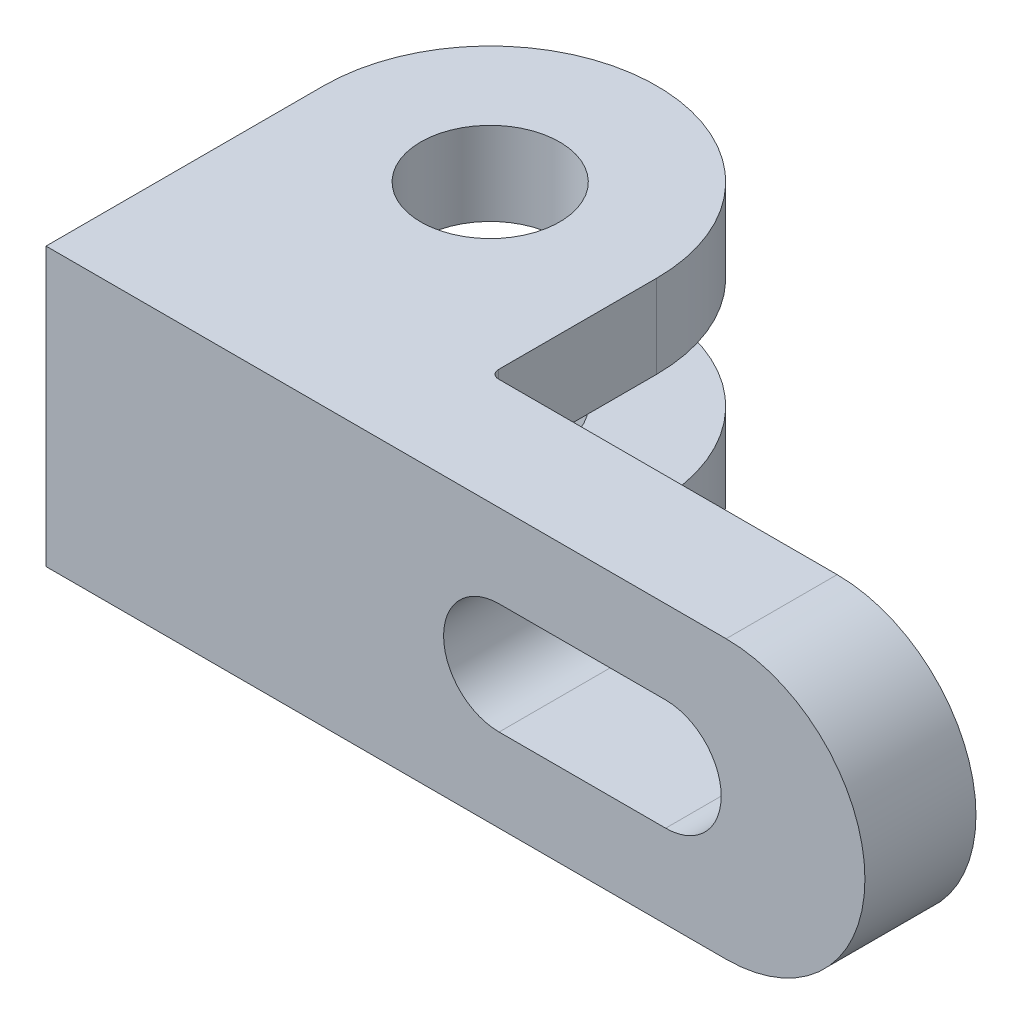
ISO-10303-21;
HEADER;
FILE_DESCRIPTION(('STEP AP214'),'2;1');
FILE_NAME('part.step','',(''),(''),'','','');
FILE_SCHEMA(('AUTOMOTIVE_DESIGN { 1 0 10303 214 1 1 1 1 }'));
ENDSEC;
DATA;
#1=APPLICATION_CONTEXT('core data for automotive mechanical design processes');
#2=APPLICATION_PROTOCOL_DEFINITION('international standard','automotive_design',2000,#1);
#3=PRODUCT_CONTEXT('',#1,'mechanical');
#4=PRODUCT('Part','Part','',(#3));
#5=PRODUCT_RELATED_PRODUCT_CATEGORY('part','',(#4));
#6=PRODUCT_DEFINITION_FORMATION('','',#4);
#7=PRODUCT_DEFINITION_CONTEXT('part definition',#1,'design');
#8=PRODUCT_DEFINITION('design','',#6,#7);
#9=PRODUCT_DEFINITION_SHAPE('','',#8);
#10=(LENGTH_UNIT() NAMED_UNIT(*) SI_UNIT(.MILLI.,.METRE.));
#11=(NAMED_UNIT(*) PLANE_ANGLE_UNIT() SI_UNIT($,.RADIAN.));
#12=(NAMED_UNIT(*) SI_UNIT($,.STERADIAN.) SOLID_ANGLE_UNIT());
#13=UNCERTAINTY_MEASURE_WITH_UNIT(LENGTH_MEASURE(1.E-05),#10,'distance_accuracy_value','');
#14=(GEOMETRIC_REPRESENTATION_CONTEXT(3) GLOBAL_UNCERTAINTY_ASSIGNED_CONTEXT((#13)) GLOBAL_UNIT_ASSIGNED_CONTEXT((#10,
#11,#12)) REPRESENTATION_CONTEXT('',''));
#15=CARTESIAN_POINT('',(0.,0.,0.));
#16=DIRECTION('',(0.,0.,1.));
#17=DIRECTION('',(1.,0.,0.));
#18=AXIS2_PLACEMENT_3D('',#15,#16,#17);
#19=CARTESIAN_POINT('',(0.,0.,-8.));
#20=DIRECTION('',(0.,0.,1.));
#21=DIRECTION('',(1.,0.,0.));
#22=AXIS2_PLACEMENT_3D('',#19,#20,#21);
#23=PLANE('',#22);
#24=DIRECTION('',(1.,0.,0.));
#25=VECTOR('',#24,1.);
#26=CARTESIAN_POINT('',(0.,8.,-8.));
#27=LINE('',#26,#25);
#28=CARTESIAN_POINT('',(6.28495317609002,8.,-8.));
#29=VERTEX_POINT('',#28);
#30=CARTESIAN_POINT('',(30.28495317609,8.,-8.));
#31=VERTEX_POINT('',#30);
#32=EDGE_CURVE('E241',#29,#31,#27,.T.);
#33=ORIENTED_EDGE('',*,*,#32,.F.);
#34=CARTESIAN_POINT('',(6.28495317609002,0.,-8.));
#35=DIRECTION('',(0.,0.,1.));
#36=DIRECTION('',(1.,0.,0.));
#37=AXIS2_PLACEMENT_3D('',#34,#35,#36);
#38=CIRCLE('',#37,8.);
#39=CARTESIAN_POINT('',(6.28495317609002,-8.,-8.));
#40=VERTEX_POINT('',#39);
#41=EDGE_CURVE('E228',#29,#40,#38,.T.);
#42=ORIENTED_EDGE('',*,*,#41,.T.);
#43=DIRECTION('',(1.,0.,0.));
#44=VECTOR('',#43,1.);
#45=CARTESIAN_POINT('',(0.,-8.,-8.));
#46=LINE('',#45,#44);
#47=CARTESIAN_POINT('',(30.28495317609,-8.,-8.));
#48=VERTEX_POINT('',#47);
#49=EDGE_CURVE('E232',#40,#48,#46,.T.);
#50=ORIENTED_EDGE('',*,*,#49,.T.);
#51=CARTESIAN_POINT('',(30.28495317609,0.,-8.));
#52=DIRECTION('',(0.,0.,1.));
#53=DIRECTION('',(1.,0.,0.));
#54=AXIS2_PLACEMENT_3D('',#51,#52,#53);
#55=CIRCLE('',#54,8.);
#56=EDGE_CURVE('E237',#48,#31,#55,.T.);
#57=ORIENTED_EDGE('',*,*,#56,.T.);
#58=EDGE_LOOP('',(#33,#42,#50,#57));
#59=FACE_BOUND('',#58,.T.);
#60=DIRECTION('',(1.,0.,0.));
#61=VECTOR('',#60,1.);
#62=CARTESIAN_POINT('',(0.,-20.,-8.));
#63=LINE('',#62,#61);
#64=CARTESIAN_POINT('',(-9.80000000000006,-20.,-8.));
#65=VERTEX_POINT('',#64);
#66=CARTESIAN_POINT('',(38.9999999999999,-20.,-8.));
#67=VERTEX_POINT('',#66);
#68=EDGE_CURVE('E261',#65,#67,#63,.T.);
#69=ORIENTED_EDGE('',*,*,#68,.F.);
#70=DIRECTION('',(0.,-1.,0.));
#71=VECTOR('',#70,1.);
#72=CARTESIAN_POINT('',(-9.80000000000006,-8.00000000000001,-8.));
#73=LINE('',#72,#71);
#74=CARTESIAN_POINT('',(-9.80000000000006,-8.00000000000001,-8.));
#75=VERTEX_POINT('',#74);
#76=EDGE_CURVE('E335',#65,#75,#73,.F.);
#77=ORIENTED_EDGE('',*,*,#76,.T.);
#78=DIRECTION('',(-1.,0.,0.));
#79=VECTOR('',#78,1.);
#80=CARTESIAN_POINT('',(0.,-8.00000000000001,-8.));
#81=LINE('',#80,#79);
#82=CARTESIAN_POINT('',(-59.0000000000001,-8.00000000000001,-8.));
#83=VERTEX_POINT('',#82);
#84=EDGE_CURVE('E56',#75,#83,#81,.T.);
#85=ORIENTED_EDGE('',*,*,#84,.T.);
#86=DIRECTION('',(0.,-1.,0.));
#87=VECTOR('',#86,1.);
#88=CARTESIAN_POINT('',(-59.0000000000001,0.,-8.));
#89=LINE('',#88,#87);
#90=CARTESIAN_POINT('',(-59.0000000000001,8.00000000000001,-8.));
#91=VERTEX_POINT('',#90);
#92=EDGE_CURVE('E276',#91,#83,#89,.T.);
#93=ORIENTED_EDGE('',*,*,#92,.F.);
#94=DIRECTION('',(-1.,0.,0.));
#95=VECTOR('',#94,1.);
#96=CARTESIAN_POINT('',(0.,8.00000000000001,-8.));
#97=LINE('',#96,#95);
#98=CARTESIAN_POINT('',(-9.80000000000006,8.00000000000001,-8.));
#99=VERTEX_POINT('',#98);
#100=EDGE_CURVE('E207',#99,#91,#97,.T.);
#101=ORIENTED_EDGE('',*,*,#100,.F.);
#102=DIRECTION('',(0.,1.,0.));
#103=VECTOR('',#102,1.);
#104=CARTESIAN_POINT('',(-9.80000000000006,0.,-8.));
#105=LINE('',#104,#103);
#106=CARTESIAN_POINT('',(-9.80000000000006,20.,-8.));
#107=VERTEX_POINT('',#106);
#108=EDGE_CURVE('E312',#99,#107,#105,.T.);
#109=ORIENTED_EDGE('',*,*,#108,.T.);
#110=DIRECTION('',(1.,0.,0.));
#111=VECTOR('',#110,1.);
#112=CARTESIAN_POINT('',(0.,20.,-8.));
#113=LINE('',#112,#111);
#114=CARTESIAN_POINT('',(38.9999999999999,20.,-8.));
#115=VERTEX_POINT('',#114);
#116=EDGE_CURVE('E293',#107,#115,#113,.T.);
#117=ORIENTED_EDGE('',*,*,#116,.T.);
#118=CARTESIAN_POINT('',(38.9999999999999,0.,-8.));
#119=DIRECTION('',(0.,0.,1.));
#120=DIRECTION('',(1.,0.,0.));
#121=AXIS2_PLACEMENT_3D('',#118,#119,#120);
#122=CIRCLE('',#121,20.);
#123=EDGE_CURVE('E289',#67,#115,#122,.T.);
#124=ORIENTED_EDGE('',*,*,#123,.F.);
#125=EDGE_LOOP('',(#69,#77,#85,#93,#101,#109,#117,#124));
#126=FACE_BOUND('',#125,.T.);
#127=ADVANCED_FACE('F41',(#59,#126),#23,.F.);
#128=CARTESIAN_POINT('',(0.,-20.,8.));
#129=DIRECTION('',(0.,1.,0.));
#130=DIRECTION('',(0.,0.,1.));
#131=AXIS2_PLACEMENT_3D('',#128,#129,#130);
#132=PLANE('',#131);
#133=CARTESIAN_POINT('',(-35.0000000000001,-20.,-32.));
#134=DIRECTION('',(0.,1.,0.));
#135=DIRECTION('',(-1.,0.,0.));
#136=AXIS2_PLACEMENT_3D('',#133,#134,#135);
#137=CIRCLE('',#136,10.);
#138=CARTESIAN_POINT('',(-45.0000000000001,-20.,-32.));
#139=VERTEX_POINT('',#138);
#140=EDGE_CURVE('E183',#139,#139,#137,.T.);
#141=ORIENTED_EDGE('',*,*,#140,.T.);
#142=EDGE_LOOP('',(#141));
#143=FACE_BOUND('',#142,.T.);
#144=DIRECTION('',(0.,0.,-1.));
#145=VECTOR('',#144,1.);
#146=CARTESIAN_POINT('',(-59.0000000000001,-20.,8.));
#147=LINE('',#146,#145);
#148=CARTESIAN_POINT('',(-59.0000000000001,-20.,8.));
#149=VERTEX_POINT('',#148);
#150=CARTESIAN_POINT('',(-59.0000000000001,-20.,-32.));
#151=VERTEX_POINT('',#150);
#152=EDGE_CURVE('E286',#149,#151,#147,.T.);
#153=ORIENTED_EDGE('',*,*,#152,.T.);
#154=CARTESIAN_POINT('',(-35.0000000000001,-20.,-32.));
#155=DIRECTION('',(0.,1.,0.));
#156=DIRECTION('',(-1.,0.,0.));
#157=AXIS2_PLACEMENT_3D('',#154,#155,#156);
#158=CIRCLE('',#157,24.);
#159=CARTESIAN_POINT('',(-11.0000000000001,-20.,-32.));
#160=VERTEX_POINT('',#159);
#161=EDGE_CURVE('E180',#160,#151,#158,.T.);
#162=ORIENTED_EDGE('',*,*,#161,.F.);
#163=DIRECTION('',(0.,0.,-1.));
#164=VECTOR('',#163,1.);
#165=CARTESIAN_POINT('',(-11.0000000000001,-20.,0.));
#166=LINE('',#165,#164);
#167=CARTESIAN_POINT('',(-11.0000000000001,-20.,-9.2));
#168=VERTEX_POINT('',#167);
#169=EDGE_CURVE('E166',#168,#160,#166,.T.);
#170=ORIENTED_EDGE('',*,*,#169,.F.);
#171=CARTESIAN_POINT('',(-9.80000000000006,-20.,-9.2));
#172=DIRECTION('',(0.,1.,0.));
#173=DIRECTION('',(0.,0.,1.));
#174=AXIS2_PLACEMENT_3D('',#171,#172,#173);
#175=CIRCLE('',#174,1.2);
#176=EDGE_CURVE('E50',#168,#65,#175,.T.);
#177=ORIENTED_EDGE('',*,*,#176,.T.);
#178=ORIENTED_EDGE('',*,*,#68,.T.);
#179=DIRECTION('',(0.,0.,-1.));
#180=VECTOR('',#179,1.);
#181=CARTESIAN_POINT('',(38.9999999999999,-20.,8.));
#182=LINE('',#181,#180);
#183=CARTESIAN_POINT('',(38.9999999999999,-20.,8.));
#184=VERTEX_POINT('',#183);
#185=EDGE_CURVE('E308',#184,#67,#182,.T.);
#186=ORIENTED_EDGE('',*,*,#185,.F.);
#187=DIRECTION('',(1.,0.,0.));
#188=VECTOR('',#187,1.);
#189=CARTESIAN_POINT('',(0.,-20.,8.));
#190=LINE('',#189,#188);
#191=EDGE_CURVE('E271',#149,#184,#190,.T.);
#192=ORIENTED_EDGE('',*,*,#191,.F.);
#193=EDGE_LOOP('',(#153,#162,#170,#177,#178,#186,#192));
#194=FACE_BOUND('',#193,.T.);
#195=ADVANCED_FACE('F343',(#143,#194),#132,.F.);
#196=CARTESIAN_POINT('',(38.9999999999999,0.,8.));
#197=DIRECTION('',(0.,0.,-1.));
#198=DIRECTION('',(-1.,0.,0.));
#199=AXIS2_PLACEMENT_3D('',#196,#197,#198);
#200=CYLINDRICAL_SURFACE('',#199,20.);
#201=ORIENTED_EDGE('',*,*,#123,.T.);
#202=DIRECTION('',(0.,0.,-1.));
#203=VECTOR('',#202,1.);
#204=CARTESIAN_POINT('',(38.9999999999999,20.,8.));
#205=LINE('',#204,#203);
#206=CARTESIAN_POINT('',(38.9999999999999,20.,8.));
#207=VERTEX_POINT('',#206);
#208=EDGE_CURVE('E304',#207,#115,#205,.T.);
#209=ORIENTED_EDGE('',*,*,#208,.F.);
#210=CARTESIAN_POINT('',(38.9999999999999,0.,8.));
#211=DIRECTION('',(0.,0.,1.));
#212=DIRECTION('',(1.,0.,0.));
#213=AXIS2_PLACEMENT_3D('',#210,#211,#212);
#214=CIRCLE('',#213,20.);
#215=EDGE_CURVE('E275',#184,#207,#214,.T.);
#216=ORIENTED_EDGE('',*,*,#215,.F.);
#217=ORIENTED_EDGE('',*,*,#185,.T.);
#218=EDGE_LOOP('',(#201,#209,#216,#217));
#219=FACE_BOUND('',#218,.T.);
#220=ADVANCED_FACE('F376',(#219),#200,.T.);
#221=CARTESIAN_POINT('',(0.,20.,8.));
#222=DIRECTION('',(0.,1.,0.));
#223=DIRECTION('',(-1.,0.,0.));
#224=AXIS2_PLACEMENT_3D('',#221,#222,#223);
#225=PLANE('',#224);
#226=CARTESIAN_POINT('',(-35.0000000000001,20.,-32.));
#227=DIRECTION('',(0.,1.,0.));
#228=DIRECTION('',(-1.,0.,0.));
#229=AXIS2_PLACEMENT_3D('',#226,#227,#228);
#230=CIRCLE('',#229,10.);
#231=CARTESIAN_POINT('',(-45.0000000000001,20.,-32.));
#232=VERTEX_POINT('',#231);
#233=EDGE_CURVE('E193',#232,#232,#230,.T.);
#234=ORIENTED_EDGE('',*,*,#233,.F.);
#235=EDGE_LOOP('',(#234));
#236=FACE_BOUND('',#235,.T.);
#237=ORIENTED_EDGE('',*,*,#116,.F.);
#238=CARTESIAN_POINT('',(-9.80000000000006,20.,-9.2));
#239=DIRECTION('',(0.,1.,0.));
#240=DIRECTION('',(-1.,0.,0.));
#241=AXIS2_PLACEMENT_3D('',#238,#239,#240);
#242=CIRCLE('',#241,1.2);
#243=CARTESIAN_POINT('',(-11.0000000000001,20.,-9.2));
#244=VERTEX_POINT('',#243);
#245=EDGE_CURVE('E325',#107,#244,#242,.F.);
#246=ORIENTED_EDGE('',*,*,#245,.T.);
#247=DIRECTION('',(0.,0.,-1.));
#248=VECTOR('',#247,1.);
#249=CARTESIAN_POINT('',(-11.0000000000001,20.,0.));
#250=LINE('',#249,#248);
#251=CARTESIAN_POINT('',(-11.0000000000001,20.,-32.));
#252=VERTEX_POINT('',#251);
#253=EDGE_CURVE('E204',#244,#252,#250,.T.);
#254=ORIENTED_EDGE('',*,*,#253,.T.);
#255=CARTESIAN_POINT('',(-35.0000000000001,20.,-32.));
#256=DIRECTION('',(0.,1.,0.));
#257=DIRECTION('',(-1.,0.,0.));
#258=AXIS2_PLACEMENT_3D('',#255,#256,#257);
#259=CIRCLE('',#258,24.);
#260=CARTESIAN_POINT('',(-59.0000000000001,20.,-32.));
#261=VERTEX_POINT('',#260);
#262=EDGE_CURVE('E214',#252,#261,#259,.T.);
#263=ORIENTED_EDGE('',*,*,#262,.T.);
#264=DIRECTION('',(0.,0.,-1.));
#265=VECTOR('',#264,1.);
#266=CARTESIAN_POINT('',(-59.0000000000001,20.,8.));
#267=LINE('',#266,#265);
#268=CARTESIAN_POINT('',(-59.0000000000001,20.,8.));
#269=VERTEX_POINT('',#268);
#270=EDGE_CURVE('E301',#269,#261,#267,.T.);
#271=ORIENTED_EDGE('',*,*,#270,.F.);
#272=DIRECTION('',(1.,0.,0.));
#273=VECTOR('',#272,1.);
#274=CARTESIAN_POINT('',(0.,20.,8.));
#275=LINE('',#274,#273);
#276=EDGE_CURVE('E279',#269,#207,#275,.T.);
#277=ORIENTED_EDGE('',*,*,#276,.T.);
#278=ORIENTED_EDGE('',*,*,#208,.T.);
#279=EDGE_LOOP('',(#237,#246,#254,#263,#271,#277,#278));
#280=FACE_BOUND('',#279,.T.);
#281=ADVANCED_FACE('F364',(#236,#280),#225,.T.);
#282=CARTESIAN_POINT('',(-59.0000000000001,0.,8.));
#283=DIRECTION('',(1.,0.,0.));
#284=DIRECTION('',(0.,0.,-1.));
#285=AXIS2_PLACEMENT_3D('',#282,#283,#284);
#286=PLANE('',#285);
#287=ORIENTED_EDGE('',*,*,#270,.T.);
#288=DIRECTION('',(0.,1.,0.));
#289=VECTOR('',#288,1.);
#290=CARTESIAN_POINT('',(-59.0000000000001,8.00000000000001,-32.));
#291=LINE('',#290,#289);
#292=CARTESIAN_POINT('',(-59.0000000000001,8.00000000000001,-32.));
#293=VERTEX_POINT('',#292);
#294=EDGE_CURVE('E213',#293,#261,#291,.T.);
#295=ORIENTED_EDGE('',*,*,#294,.F.);
#296=DIRECTION('',(0.,0.,-1.));
#297=VECTOR('',#296,1.);
#298=CARTESIAN_POINT('',(-59.0000000000001,8.00000000000001,0.));
#299=LINE('',#298,#297);
#300=EDGE_CURVE('E203',#91,#293,#299,.T.);
#301=ORIENTED_EDGE('',*,*,#300,.F.);
#302=ORIENTED_EDGE('',*,*,#92,.T.);
#303=DIRECTION('',(0.,0.,-1.));
#304=VECTOR('',#303,1.);
#305=CARTESIAN_POINT('',(-59.0000000000001,-8.00000000000001,0.));
#306=LINE('',#305,#304);
#307=CARTESIAN_POINT('',(-59.0000000000001,-8.00000000000001,-32.));
#308=VERTEX_POINT('',#307);
#309=EDGE_CURVE('E172',#83,#308,#306,.T.);
#310=ORIENTED_EDGE('',*,*,#309,.T.);
#311=DIRECTION('',(0.,-1.,0.));
#312=VECTOR('',#311,1.);
#313=CARTESIAN_POINT('',(-59.0000000000001,-8.00000000000001,-32.));
#314=LINE('',#313,#312);
#315=EDGE_CURVE('E171',#308,#151,#314,.T.);
#316=ORIENTED_EDGE('',*,*,#315,.T.);
#317=ORIENTED_EDGE('',*,*,#152,.F.);
#318=DIRECTION('',(0.,-1.,0.));
#319=VECTOR('',#318,1.);
#320=CARTESIAN_POINT('',(-59.0000000000001,0.,8.));
#321=LINE('',#320,#319);
#322=EDGE_CURVE('E283',#269,#149,#321,.T.);
#323=ORIENTED_EDGE('',*,*,#322,.F.);
#324=EDGE_LOOP('',(#287,#295,#301,#302,#310,#316,#317,#323));
#325=FACE_BOUND('',#324,.T.);
#326=ADVANCED_FACE('F349',(#325),#286,.F.);
#327=CARTESIAN_POINT('',(0.,0.,8.));
#328=DIRECTION('',(0.,0.,1.));
#329=DIRECTION('',(1.,0.,0.));
#330=AXIS2_PLACEMENT_3D('',#327,#328,#329);
#331=PLANE('',#330);
#332=CARTESIAN_POINT('',(6.28495317609002,0.,8.));
#333=DIRECTION('',(0.,0.,1.));
#334=DIRECTION('',(1.,0.,0.));
#335=AXIS2_PLACEMENT_3D('',#332,#333,#334);
#336=CIRCLE('',#335,8.);
#337=CARTESIAN_POINT('',(6.28495317609002,8.,8.));
#338=VERTEX_POINT('',#337);
#339=CARTESIAN_POINT('',(6.28495317609002,-8.,8.));
#340=VERTEX_POINT('',#339);
#341=EDGE_CURVE('E224',#338,#340,#336,.T.);
#342=ORIENTED_EDGE('',*,*,#341,.F.);
#343=DIRECTION('',(1.,0.,0.));
#344=VECTOR('',#343,1.);
#345=CARTESIAN_POINT('',(0.,8.,8.));
#346=LINE('',#345,#344);
#347=CARTESIAN_POINT('',(30.28495317609,8.,8.));
#348=VERTEX_POINT('',#347);
#349=EDGE_CURVE('E233',#338,#348,#346,.T.);
#350=ORIENTED_EDGE('',*,*,#349,.T.);
#351=CARTESIAN_POINT('',(30.28495317609,0.,8.));
#352=DIRECTION('',(0.,0.,1.));
#353=DIRECTION('',(1.,0.,0.));
#354=AXIS2_PLACEMENT_3D('',#351,#352,#353);
#355=CIRCLE('',#354,8.);
#356=CARTESIAN_POINT('',(30.28495317609,-8.,8.));
#357=VERTEX_POINT('',#356);
#358=EDGE_CURVE('E251',#357,#348,#355,.T.);
#359=ORIENTED_EDGE('',*,*,#358,.F.);
#360=DIRECTION('',(1.,0.,0.));
#361=VECTOR('',#360,1.);
#362=CARTESIAN_POINT('',(0.,-8.,8.));
#363=LINE('',#362,#361);
#364=EDGE_CURVE('E247',#340,#357,#363,.T.);
#365=ORIENTED_EDGE('',*,*,#364,.F.);
#366=EDGE_LOOP('',(#342,#350,#359,#365));
#367=FACE_BOUND('',#366,.T.);
#368=ORIENTED_EDGE('',*,*,#191,.T.);
#369=ORIENTED_EDGE('',*,*,#215,.T.);
#370=ORIENTED_EDGE('',*,*,#276,.F.);
#371=ORIENTED_EDGE('',*,*,#322,.T.);
#372=EDGE_LOOP('',(#368,#369,#370,#371));
#373=FACE_BOUND('',#372,.T.);
#374=ADVANCED_FACE('F373',(#367,#373),#331,.T.);
#375=CARTESIAN_POINT('',(6.28495317609002,0.,-8.));
#376=DIRECTION('',(0.,0.,1.));
#377=DIRECTION('',(1.,0.,0.));
#378=AXIS2_PLACEMENT_3D('',#375,#376,#377);
#379=CYLINDRICAL_SURFACE('',#378,8.);
#380=ORIENTED_EDGE('',*,*,#341,.T.);
#381=DIRECTION('',(0.,0.,1.));
#382=VECTOR('',#381,1.);
#383=CARTESIAN_POINT('',(6.28495317609002,-8.,-8.));
#384=LINE('',#383,#382);
#385=EDGE_CURVE('E244',#40,#340,#384,.T.);
#386=ORIENTED_EDGE('',*,*,#385,.F.);
#387=ORIENTED_EDGE('',*,*,#41,.F.);
#388=DIRECTION('',(0.,0.,1.));
#389=VECTOR('',#388,1.);
#390=CARTESIAN_POINT('',(6.28495317609002,8.,-8.));
#391=LINE('',#390,#389);
#392=EDGE_CURVE('E258',#29,#338,#391,.T.);
#393=ORIENTED_EDGE('',*,*,#392,.T.);
#394=EDGE_LOOP('',(#380,#386,#387,#393));
#395=FACE_BOUND('',#394,.T.);
#396=ADVANCED_FACE('F400',(#395),#379,.F.);
#397=CARTESIAN_POINT('',(0.,8.,-8.));
#398=DIRECTION('',(0.,-1.,0.));
#399=DIRECTION('',(0.,0.,-1.));
#400=AXIS2_PLACEMENT_3D('',#397,#398,#399);
#401=PLANE('',#400);
#402=ORIENTED_EDGE('',*,*,#349,.F.);
#403=ORIENTED_EDGE('',*,*,#392,.F.);
#404=ORIENTED_EDGE('',*,*,#32,.T.);
#405=DIRECTION('',(0.,0.,1.));
#406=VECTOR('',#405,1.);
#407=CARTESIAN_POINT('',(30.28495317609,8.,-8.));
#408=LINE('',#407,#406);
#409=EDGE_CURVE('E262',#31,#348,#408,.T.);
#410=ORIENTED_EDGE('',*,*,#409,.T.);
#411=EDGE_LOOP('',(#402,#403,#404,#410));
#412=FACE_BOUND('',#411,.T.);
#413=ADVANCED_FACE('F405',(#412),#401,.T.);
#414=CARTESIAN_POINT('',(30.28495317609,0.,-8.));
#415=DIRECTION('',(0.,0.,1.));
#416=DIRECTION('',(1.,0.,0.));
#417=AXIS2_PLACEMENT_3D('',#414,#415,#416);
#418=CYLINDRICAL_SURFACE('',#417,8.);
#419=ORIENTED_EDGE('',*,*,#358,.T.);
#420=ORIENTED_EDGE('',*,*,#409,.F.);
#421=ORIENTED_EDGE('',*,*,#56,.F.);
#422=DIRECTION('',(0.,0.,1.));
#423=VECTOR('',#422,1.);
#424=CARTESIAN_POINT('',(30.28495317609,-8.,-8.));
#425=LINE('',#424,#423);
#426=EDGE_CURVE('E265',#48,#357,#425,.T.);
#427=ORIENTED_EDGE('',*,*,#426,.T.);
#428=EDGE_LOOP('',(#419,#420,#421,#427));
#429=FACE_BOUND('',#428,.T.);
#430=ADVANCED_FACE('F419',(#429),#418,.F.);
#431=CARTESIAN_POINT('',(0.,-8.,-8.));
#432=DIRECTION('',(0.,-1.,0.));
#433=DIRECTION('',(0.,0.,-1.));
#434=AXIS2_PLACEMENT_3D('',#431,#432,#433);
#435=PLANE('',#434);
#436=ORIENTED_EDGE('',*,*,#364,.T.);
#437=ORIENTED_EDGE('',*,*,#426,.F.);
#438=ORIENTED_EDGE('',*,*,#49,.F.);
#439=ORIENTED_EDGE('',*,*,#385,.T.);
#440=EDGE_LOOP('',(#436,#437,#438,#439));
#441=FACE_BOUND('',#440,.T.);
#442=ADVANCED_FACE('F414',(#441),#435,.F.);
#443=CARTESIAN_POINT('',(-35.0000000000001,8.00000000000001,-32.));
#444=DIRECTION('',(0.,1.,0.));
#445=DIRECTION('',(-1.,0.,0.));
#446=AXIS2_PLACEMENT_3D('',#443,#444,#445);
#447=CYLINDRICAL_SURFACE('',#446,24.);
#448=ORIENTED_EDGE('',*,*,#262,.F.);
#449=DIRECTION('',(0.,1.,0.));
#450=VECTOR('',#449,1.);
#451=CARTESIAN_POINT('',(-11.0000000000001,8.00000000000001,-32.));
#452=LINE('',#451,#450);
#453=CARTESIAN_POINT('',(-11.0000000000001,8.00000000000001,-32.));
#454=VERTEX_POINT('',#453);
#455=EDGE_CURVE('E220',#454,#252,#452,.T.);
#456=ORIENTED_EDGE('',*,*,#455,.F.);
#457=CARTESIAN_POINT('',(-35.0000000000001,8.00000000000001,-32.));
#458=DIRECTION('',(0.,1.,0.));
#459=DIRECTION('',(-1.,0.,0.));
#460=AXIS2_PLACEMENT_3D('',#457,#458,#459);
#461=CIRCLE('',#460,24.);
#462=EDGE_CURVE('E199',#454,#293,#461,.T.);
#463=ORIENTED_EDGE('',*,*,#462,.T.);
#464=ORIENTED_EDGE('',*,*,#294,.T.);
#465=EDGE_LOOP('',(#448,#456,#463,#464));
#466=FACE_BOUND('',#465,.T.);
#467=ADVANCED_FACE('F370',(#466),#447,.T.);
#468=CARTESIAN_POINT('',(-11.0000000000001,8.00000000000001,0.));
#469=DIRECTION('',(1.,0.,0.));
#470=DIRECTION('',(0.,1.,0.));
#471=AXIS2_PLACEMENT_3D('',#468,#469,#470);
#472=PLANE('',#471);
#473=ORIENTED_EDGE('',*,*,#253,.F.);
#474=DIRECTION('',(0.,1.,0.));
#475=VECTOR('',#474,1.);
#476=CARTESIAN_POINT('',(-11.0000000000001,8.00000000000001,-9.2));
#477=LINE('',#476,#475);
#478=CARTESIAN_POINT('',(-11.0000000000001,8.00000000000001,-9.2));
#479=VERTEX_POINT('',#478);
#480=EDGE_CURVE('E322',#244,#479,#477,.F.);
#481=ORIENTED_EDGE('',*,*,#480,.T.);
#482=DIRECTION('',(0.,0.,-1.));
#483=VECTOR('',#482,1.);
#484=CARTESIAN_POINT('',(-11.0000000000001,8.00000000000001,0.));
#485=LINE('',#484,#483);
#486=EDGE_CURVE('E210',#479,#454,#485,.T.);
#487=ORIENTED_EDGE('',*,*,#486,.T.);
#488=ORIENTED_EDGE('',*,*,#455,.T.);
#489=EDGE_LOOP('',(#473,#481,#487,#488));
#490=FACE_BOUND('',#489,.T.);
#491=ADVANCED_FACE('F366',(#490),#472,.T.);
#492=CARTESIAN_POINT('',(0.,8.00000000000001,0.));
#493=DIRECTION('',(0.,1.,0.));
#494=DIRECTION('',(-1.,0.,0.));
#495=AXIS2_PLACEMENT_3D('',#492,#493,#494);
#496=PLANE('',#495);
#497=CARTESIAN_POINT('',(-35.0000000000001,8.00000000000001,-32.));
#498=DIRECTION('',(0.,1.,0.));
#499=DIRECTION('',(-1.,0.,0.));
#500=AXIS2_PLACEMENT_3D('',#497,#498,#499);
#501=CIRCLE('',#500,10.);
#502=CARTESIAN_POINT('',(-45.0000000000001,8.00000000000001,-32.));
#503=VERTEX_POINT('',#502);
#504=EDGE_CURVE('E198',#503,#503,#501,.T.);
#505=ORIENTED_EDGE('',*,*,#504,.T.);
#506=EDGE_LOOP('',(#505));
#507=FACE_BOUND('',#506,.T.);
#508=ORIENTED_EDGE('',*,*,#462,.F.);
#509=ORIENTED_EDGE('',*,*,#486,.F.);
#510=CARTESIAN_POINT('',(-9.80000000000006,8.00000000000001,-9.2));
#511=DIRECTION('',(0.,1.,0.));
#512=DIRECTION('',(-1.,0.,0.));
#513=AXIS2_PLACEMENT_3D('',#510,#511,#512);
#514=CIRCLE('',#513,1.2);
#515=EDGE_CURVE('E328',#479,#99,#514,.T.);
#516=ORIENTED_EDGE('',*,*,#515,.T.);
#517=ORIENTED_EDGE('',*,*,#100,.T.);
#518=ORIENTED_EDGE('',*,*,#300,.T.);
#519=EDGE_LOOP('',(#508,#509,#516,#517,#518));
#520=FACE_BOUND('',#519,.T.);
#521=ADVANCED_FACE('F358',(#507,#520),#496,.F.);
#522=CARTESIAN_POINT('',(-35.0000000000001,-20.,-32.));
#523=DIRECTION('',(0.,1.,0.));
#524=DIRECTION('',(-1.,0.,0.));
#525=AXIS2_PLACEMENT_3D('',#522,#523,#524);
#526=CYLINDRICAL_SURFACE('',#525,10.);
#527=ORIENTED_EDGE('',*,*,#233,.T.);
#528=EDGE_LOOP('',(#527));
#529=FACE_BOUND('',#528,.T.);
#530=ORIENTED_EDGE('',*,*,#504,.F.);
#531=EDGE_LOOP('',(#530));
#532=FACE_BOUND('',#531,.T.);
#533=ADVANCED_FACE('F435',(#529,#532),#526,.F.);
#534=CARTESIAN_POINT('',(-35.0000000000001,-8.00000000000001,-32.));
#535=DIRECTION('',(0.,-1.,0.));
#536=DIRECTION('',(1.,0.,0.));
#537=AXIS2_PLACEMENT_3D('',#534,#535,#536);
#538=CYLINDRICAL_SURFACE('',#537,24.);
#539=ORIENTED_EDGE('',*,*,#161,.T.);
#540=ORIENTED_EDGE('',*,*,#315,.F.);
#541=CARTESIAN_POINT('',(-35.0000000000001,-8.00000000000001,-32.));
#542=DIRECTION('',(0.,1.,0.));
#543=DIRECTION('',(-1.,0.,0.));
#544=AXIS2_PLACEMENT_3D('',#541,#542,#543);
#545=CIRCLE('',#544,24.);
#546=CARTESIAN_POINT('',(-11.0000000000001,-8.00000000000001,-32.));
#547=VERTEX_POINT('',#546);
#548=EDGE_CURVE('E155',#547,#308,#545,.T.);
#549=ORIENTED_EDGE('',*,*,#548,.F.);
#550=DIRECTION('',(0.,-1.,0.));
#551=VECTOR('',#550,1.);
#552=CARTESIAN_POINT('',(-11.0000000000001,-8.00000000000001,-32.));
#553=LINE('',#552,#551);
#554=EDGE_CURVE('E164',#547,#160,#553,.T.);
#555=ORIENTED_EDGE('',*,*,#554,.T.);
#556=EDGE_LOOP('',(#539,#540,#549,#555));
#557=FACE_BOUND('',#556,.T.);
#558=ADVANCED_FACE('F174',(#557),#538,.T.);
#559=CARTESIAN_POINT('',(-11.0000000000001,-8.00000000000001,0.));
#560=DIRECTION('',(-1.,0.,0.));
#561=DIRECTION('',(0.,-1.,0.));
#562=AXIS2_PLACEMENT_3D('',#559,#560,#561);
#563=PLANE('',#562);
#564=DIRECTION('',(0.,0.,-1.));
#565=VECTOR('',#564,1.);
#566=CARTESIAN_POINT('',(-11.0000000000001,-8.00000000000001,0.));
#567=LINE('',#566,#565);
#568=CARTESIAN_POINT('',(-11.0000000000001,-8.00000000000001,-9.2));
#569=VERTEX_POINT('',#568);
#570=EDGE_CURVE('E151',#569,#547,#567,.T.);
#571=ORIENTED_EDGE('',*,*,#570,.F.);
#572=DIRECTION('',(0.,-1.,0.));
#573=VECTOR('',#572,1.);
#574=CARTESIAN_POINT('',(-11.0000000000001,-20.,-9.2));
#575=LINE('',#574,#573);
#576=EDGE_CURVE('E332',#569,#168,#575,.T.);
#577=ORIENTED_EDGE('',*,*,#576,.T.);
#578=ORIENTED_EDGE('',*,*,#169,.T.);
#579=ORIENTED_EDGE('',*,*,#554,.F.);
#580=EDGE_LOOP('',(#571,#577,#578,#579));
#581=FACE_BOUND('',#580,.T.);
#582=ADVANCED_FACE('F165',(#581),#563,.F.);
#583=CARTESIAN_POINT('',(0.,-8.00000000000001,0.));
#584=DIRECTION('',(0.,-1.,0.));
#585=DIRECTION('',(-1.,0.,0.));
#586=AXIS2_PLACEMENT_3D('',#583,#584,#585);
#587=PLANE('',#586);
#588=CARTESIAN_POINT('',(-35.0000000000001,-8.00000000000001,-32.));
#589=DIRECTION('',(0.,-1.,0.));
#590=DIRECTION('',(1.,0.,0.));
#591=AXIS2_PLACEMENT_3D('',#588,#589,#590);
#592=CIRCLE('',#591,10.);
#593=CARTESIAN_POINT('',(-25.0000000000001,-8.00000000000001,-32.));
#594=VERTEX_POINT('',#593);
#595=EDGE_CURVE('E190',#594,#594,#592,.F.);
#596=ORIENTED_EDGE('',*,*,#595,.F.);
#597=EDGE_LOOP('',(#596));
#598=FACE_BOUND('',#597,.T.);
#599=ORIENTED_EDGE('',*,*,#548,.T.);
#600=ORIENTED_EDGE('',*,*,#309,.F.);
#601=ORIENTED_EDGE('',*,*,#84,.F.);
#602=CARTESIAN_POINT('',(-9.80000000000006,-8.00000000000001,-9.2));
#603=DIRECTION('',(0.,-1.,0.));
#604=DIRECTION('',(1.,0.,0.));
#605=AXIS2_PLACEMENT_3D('',#602,#603,#604);
#606=CIRCLE('',#605,1.2);
#607=EDGE_CURVE('E11',#75,#569,#606,.T.);
#608=ORIENTED_EDGE('',*,*,#607,.T.);
#609=ORIENTED_EDGE('',*,*,#570,.T.);
#610=EDGE_LOOP('',(#599,#600,#601,#608,#609));
#611=FACE_BOUND('',#610,.T.);
#612=ADVANCED_FACE('F153',(#598,#611),#587,.F.);
#613=CARTESIAN_POINT('',(-35.0000000000001,20.,-32.));
#614=DIRECTION('',(0.,-1.,0.));
#615=DIRECTION('',(1.,0.,0.));
#616=AXIS2_PLACEMENT_3D('',#613,#614,#615);
#617=CYLINDRICAL_SURFACE('',#616,10.);
#618=ORIENTED_EDGE('',*,*,#140,.F.);
#619=EDGE_LOOP('',(#618));
#620=FACE_BOUND('',#619,.T.);
#621=ORIENTED_EDGE('',*,*,#595,.T.);
#622=EDGE_LOOP('',(#621));
#623=FACE_BOUND('',#622,.T.);
#624=ADVANCED_FACE('F446',(#620,#623),#617,.F.);
#625=CARTESIAN_POINT('',(-9.80000000000006,0.,-9.2));
#626=DIRECTION('',(0.,1.,0.));
#627=DIRECTION('',(-1.,0.,0.));
#628=AXIS2_PLACEMENT_3D('',#625,#626,#627);
#629=CYLINDRICAL_SURFACE('',#628,1.2);
#630=ORIENTED_EDGE('',*,*,#515,.F.);
#631=ORIENTED_EDGE('',*,*,#480,.F.);
#632=ORIENTED_EDGE('',*,*,#245,.F.);
#633=ORIENTED_EDGE('',*,*,#108,.F.);
#634=EDGE_LOOP('',(#630,#631,#632,#633));
#635=FACE_BOUND('',#634,.T.);
#636=ADVANCED_FACE('F361',(#635),#629,.F.);
#637=CARTESIAN_POINT('',(-9.80000000000006,-8.00000000000001,-9.2));
#638=DIRECTION('',(0.,1.,0.));
#639=DIRECTION('',(-1.,0.,0.));
#640=AXIS2_PLACEMENT_3D('',#637,#638,#639);
#641=CYLINDRICAL_SURFACE('',#640,1.2);
#642=ORIENTED_EDGE('',*,*,#607,.F.);
#643=ORIENTED_EDGE('',*,*,#76,.F.);
#644=ORIENTED_EDGE('',*,*,#176,.F.);
#645=ORIENTED_EDGE('',*,*,#576,.F.);
#646=EDGE_LOOP('',(#642,#643,#644,#645));
#647=FACE_BOUND('',#646,.T.);
#648=ADVANCED_FACE('F43',(#647),#641,.F.);
#649=CLOSED_SHELL('',(#127,#195,#220,#281,#326,#374,#396,#413,#430,#442,#467,#491,#521,#533,
#558,#582,#612,#624,#636,#648));
#650=MANIFOLD_SOLID_BREP('B2',#649);
#651=ADVANCED_BREP_SHAPE_REPRESENTATION('',(#18,#650),#14);
#652=SHAPE_DEFINITION_REPRESENTATION(#9,#651);
ENDSEC;
END-ISO-10303-21;
